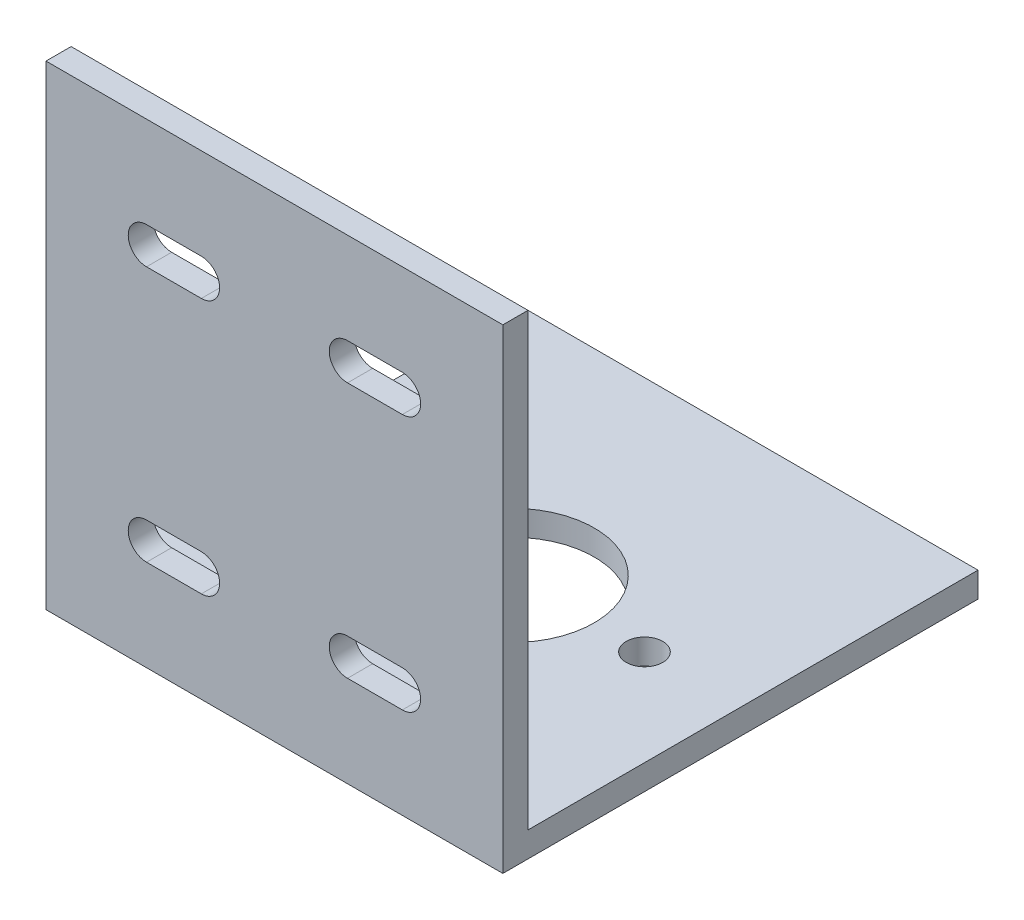
ISO-10303-21;
HEADER;
FILE_DESCRIPTION(('STEP AP214'),'2;1');
FILE_NAME('part.step','',(''),(''),'','','');
FILE_SCHEMA(('AUTOMOTIVE_DESIGN { 1 0 10303 214 1 1 1 1 }'));
ENDSEC;
DATA;
#1=APPLICATION_CONTEXT('core data for automotive mechanical design processes');
#2=APPLICATION_PROTOCOL_DEFINITION('international standard','automotive_design',2000,#1);
#3=PRODUCT_CONTEXT('',#1,'mechanical');
#4=PRODUCT('Part','Part','',(#3));
#5=PRODUCT_RELATED_PRODUCT_CATEGORY('part','',(#4));
#6=PRODUCT_DEFINITION_FORMATION('','',#4);
#7=PRODUCT_DEFINITION_CONTEXT('part definition',#1,'design');
#8=PRODUCT_DEFINITION('design','',#6,#7);
#9=PRODUCT_DEFINITION_SHAPE('','',#8);
#10=(LENGTH_UNIT() NAMED_UNIT(*) SI_UNIT(.MILLI.,.METRE.));
#11=(NAMED_UNIT(*) PLANE_ANGLE_UNIT() SI_UNIT($,.RADIAN.));
#12=(NAMED_UNIT(*) SI_UNIT($,.STERADIAN.) SOLID_ANGLE_UNIT());
#13=UNCERTAINTY_MEASURE_WITH_UNIT(LENGTH_MEASURE(1.E-05),#10,'distance_accuracy_value','');
#14=(GEOMETRIC_REPRESENTATION_CONTEXT(3) GLOBAL_UNCERTAINTY_ASSIGNED_CONTEXT((#13)) GLOBAL_UNIT_ASSIGNED_CONTEXT((#10,
#11,#12)) REPRESENTATION_CONTEXT('',''));
#15=CARTESIAN_POINT('',(0.,0.,0.));
#16=DIRECTION('',(0.,0.,1.));
#17=DIRECTION('',(1.,0.,0.));
#18=AXIS2_PLACEMENT_3D('',#15,#16,#17);
#19=CARTESIAN_POINT('',(0.,2.75,0.));
#20=DIRECTION('',(0.,-1.,0.));
#21=DIRECTION('',(0.,0.,-1.));
#22=AXIS2_PLACEMENT_3D('',#19,#20,#21);
#23=PLANE('',#22);
#24=CARTESIAN_POINT('',(14.5,2.75,0.));
#25=DIRECTION('',(0.,1.,0.));
#26=DIRECTION('',(0.,0.,1.));
#27=AXIS2_PLACEMENT_3D('',#24,#25,#26);
#28=CIRCLE('',#27,2.);
#29=CARTESIAN_POINT('',(14.5,2.75,2.));
#30=VERTEX_POINT('',#29);
#31=EDGE_CURVE('E292',#30,#30,#28,.T.);
#32=ORIENTED_EDGE('',*,*,#31,.F.);
#33=EDGE_LOOP('',(#32));
#34=FACE_BOUND('',#33,.T.);
#35=CARTESIAN_POINT('',(-14.5,2.75,0.));
#36=DIRECTION('',(0.,1.,0.));
#37=DIRECTION('',(0.,0.,1.));
#38=AXIS2_PLACEMENT_3D('',#35,#36,#37);
#39=CIRCLE('',#38,2.);
#40=CARTESIAN_POINT('',(-14.5,2.75,2.));
#41=VERTEX_POINT('',#40);
#42=EDGE_CURVE('E298',#41,#41,#39,.T.);
#43=ORIENTED_EDGE('',*,*,#42,.F.);
#44=EDGE_LOOP('',(#43));
#45=FACE_BOUND('',#44,.T.);
#46=CARTESIAN_POINT('',(0.,2.75,0.));
#47=DIRECTION('',(0.,1.,0.));
#48=DIRECTION('',(0.,0.,1.));
#49=AXIS2_PLACEMENT_3D('',#46,#47,#48);
#50=CIRCLE('',#49,9.);
#51=CARTESIAN_POINT('',(0.,2.75,9.));
#52=VERTEX_POINT('',#51);
#53=EDGE_CURVE('E304',#52,#52,#50,.T.);
#54=ORIENTED_EDGE('',*,*,#53,.F.);
#55=EDGE_LOOP('',(#54));
#56=FACE_BOUND('',#55,.T.);
#57=DIRECTION('',(-1.,0.,0.));
#58=VECTOR('',#57,1.);
#59=CARTESIAN_POINT('',(0.,2.75,23.25));
#60=LINE('',#59,#58);
#61=CARTESIAN_POINT('',(25.,2.75,23.25));
#62=VERTEX_POINT('',#61);
#63=CARTESIAN_POINT('',(-25.,2.75000000000002,23.25));
#64=VERTEX_POINT('',#63);
#65=EDGE_CURVE('E288',#62,#64,#60,.T.);
#66=ORIENTED_EDGE('',*,*,#65,.F.);
#67=DIRECTION('',(0.,0.,-1.));
#68=VECTOR('',#67,1.);
#69=CARTESIAN_POINT('',(25.,2.75,26.));
#70=LINE('',#69,#68);
#71=CARTESIAN_POINT('',(25.,2.75,-26.));
#72=VERTEX_POINT('',#71);
#73=EDGE_CURVE('E312',#62,#72,#70,.T.);
#74=ORIENTED_EDGE('',*,*,#73,.T.);
#75=DIRECTION('',(-1.,0.,0.));
#76=VECTOR('',#75,1.);
#77=CARTESIAN_POINT('',(-25.,2.75,-26.));
#78=LINE('',#77,#76);
#79=CARTESIAN_POINT('',(-25.,2.75,-26.));
#80=VERTEX_POINT('',#79);
#81=EDGE_CURVE('E315',#72,#80,#78,.T.);
#82=ORIENTED_EDGE('',*,*,#81,.T.);
#83=DIRECTION('',(0.,0.,1.));
#84=VECTOR('',#83,1.);
#85=CARTESIAN_POINT('',(-25.,2.75,26.));
#86=LINE('',#85,#84);
#87=EDGE_CURVE('E310',#80,#64,#86,.T.);
#88=ORIENTED_EDGE('',*,*,#87,.T.);
#89=EDGE_LOOP('',(#66,#74,#82,#88));
#90=FACE_BOUND('',#89,.T.);
#91=ADVANCED_FACE('F32',(#34,#45,#56,#90),#23,.F.);
#92=CARTESIAN_POINT('',(0.,0.,0.));
#93=DIRECTION('',(0.,-1.,0.));
#94=DIRECTION('',(0.,0.,-1.));
#95=AXIS2_PLACEMENT_3D('',#92,#93,#94);
#96=PLANE('',#95);
#97=DIRECTION('',(1.,0.,0.));
#98=VECTOR('',#97,1.);
#99=CARTESIAN_POINT('',(-25.,0.,26.));
#100=LINE('',#99,#98);
#101=CARTESIAN_POINT('',(-25.,0.,26.));
#102=VERTEX_POINT('',#101);
#103=CARTESIAN_POINT('',(25.,0.,26.));
#104=VERTEX_POINT('',#103);
#105=EDGE_CURVE('E319',#102,#104,#100,.T.);
#106=ORIENTED_EDGE('',*,*,#105,.F.);
#107=DIRECTION('',(0.,0.,1.));
#108=VECTOR('',#107,1.);
#109=CARTESIAN_POINT('',(-25.,0.,26.));
#110=LINE('',#109,#108);
#111=CARTESIAN_POINT('',(-25.,0.,-26.));
#112=VERTEX_POINT('',#111);
#113=EDGE_CURVE('E307',#112,#102,#110,.T.);
#114=ORIENTED_EDGE('',*,*,#113,.F.);
#115=DIRECTION('',(-1.,0.,0.));
#116=VECTOR('',#115,1.);
#117=CARTESIAN_POINT('',(-25.,0.,-26.));
#118=LINE('',#117,#116);
#119=CARTESIAN_POINT('',(25.,0.,-26.));
#120=VERTEX_POINT('',#119);
#121=EDGE_CURVE('E313',#120,#112,#118,.T.);
#122=ORIENTED_EDGE('',*,*,#121,.F.);
#123=DIRECTION('',(0.,0.,-1.));
#124=VECTOR('',#123,1.);
#125=CARTESIAN_POINT('',(25.,0.,26.));
#126=LINE('',#125,#124);
#127=EDGE_CURVE('E321',#104,#120,#126,.T.);
#128=ORIENTED_EDGE('',*,*,#127,.F.);
#129=EDGE_LOOP('',(#106,#114,#122,#128));
#130=FACE_BOUND('',#129,.T.);
#131=CARTESIAN_POINT('',(-14.5,0.,0.));
#132=DIRECTION('',(0.,1.,0.));
#133=DIRECTION('',(0.,0.,1.));
#134=AXIS2_PLACEMENT_3D('',#131,#132,#133);
#135=CIRCLE('',#134,2.);
#136=CARTESIAN_POINT('',(-14.5,0.,2.));
#137=VERTEX_POINT('',#136);
#138=EDGE_CURVE('E295',#137,#137,#135,.T.);
#139=ORIENTED_EDGE('',*,*,#138,.T.);
#140=EDGE_LOOP('',(#139));
#141=FACE_BOUND('',#140,.T.);
#142=CARTESIAN_POINT('',(0.,0.,0.));
#143=DIRECTION('',(0.,1.,0.));
#144=DIRECTION('',(0.,0.,1.));
#145=AXIS2_PLACEMENT_3D('',#142,#143,#144);
#146=CIRCLE('',#145,9.);
#147=CARTESIAN_POINT('',(0.,0.,9.));
#148=VERTEX_POINT('',#147);
#149=EDGE_CURVE('E301',#148,#148,#146,.T.);
#150=ORIENTED_EDGE('',*,*,#149,.T.);
#151=EDGE_LOOP('',(#150));
#152=FACE_BOUND('',#151,.T.);
#153=CARTESIAN_POINT('',(14.5,0.,0.));
#154=DIRECTION('',(0.,1.,0.));
#155=DIRECTION('',(0.,0.,1.));
#156=AXIS2_PLACEMENT_3D('',#153,#154,#155);
#157=CIRCLE('',#156,2.);
#158=CARTESIAN_POINT('',(14.5,0.,2.));
#159=VERTEX_POINT('',#158);
#160=EDGE_CURVE('E291',#159,#159,#157,.T.);
#161=ORIENTED_EDGE('',*,*,#160,.T.);
#162=EDGE_LOOP('',(#161));
#163=FACE_BOUND('',#162,.T.);
#164=ADVANCED_FACE('F395',(#130,#141,#152,#163),#96,.T.);
#165=CARTESIAN_POINT('',(-25.,2.75,26.));
#166=DIRECTION('',(1.,0.,0.));
#167=DIRECTION('',(0.,0.,-1.));
#168=AXIS2_PLACEMENT_3D('',#165,#166,#167);
#169=PLANE('',#168);
#170=DIRECTION('',(0.,-1.,0.));
#171=VECTOR('',#170,1.);
#172=CARTESIAN_POINT('',(-25.,2.75,26.));
#173=LINE('',#172,#171);
#174=CARTESIAN_POINT('',(-25.,52.,26.));
#175=VERTEX_POINT('',#174);
#176=EDGE_CURVE('E332',#175,#102,#173,.T.);
#177=ORIENTED_EDGE('',*,*,#176,.F.);
#178=DIRECTION('',(0.,0.,1.));
#179=VECTOR('',#178,1.);
#180=CARTESIAN_POINT('',(-25.,52.,26.));
#181=LINE('',#180,#179);
#182=CARTESIAN_POINT('',(-25.,52.,23.25));
#183=VERTEX_POINT('',#182);
#184=EDGE_CURVE('E266',#183,#175,#181,.T.);
#185=ORIENTED_EDGE('',*,*,#184,.F.);
#186=DIRECTION('',(0.,-1.,0.));
#187=VECTOR('',#186,1.);
#188=CARTESIAN_POINT('',(-25.,52.,23.25));
#189=LINE('',#188,#187);
#190=EDGE_CURVE('E282',#183,#64,#189,.T.);
#191=ORIENTED_EDGE('',*,*,#190,.T.);
#192=ORIENTED_EDGE('',*,*,#87,.F.);
#193=DIRECTION('',(0.,-1.,0.));
#194=VECTOR('',#193,1.);
#195=CARTESIAN_POINT('',(-25.,2.75,-26.));
#196=LINE('',#195,#194);
#197=EDGE_CURVE('E317',#80,#112,#196,.T.);
#198=ORIENTED_EDGE('',*,*,#197,.T.);
#199=ORIENTED_EDGE('',*,*,#113,.T.);
#200=EDGE_LOOP('',(#177,#185,#191,#192,#198,#199));
#201=FACE_BOUND('',#200,.T.);
#202=ADVANCED_FACE('F34',(#201),#169,.F.);
#203=CARTESIAN_POINT('',(-25.,2.75,26.));
#204=DIRECTION('',(0.,0.,-1.));
#205=DIRECTION('',(-1.,0.,0.));
#206=AXIS2_PLACEMENT_3D('',#203,#204,#205);
#207=PLANE('',#206);
#208=DIRECTION('',(1.,0.,0.));
#209=VECTOR('',#208,1.);
#210=CARTESIAN_POINT('',(8.,10.,26.));
#211=LINE('',#210,#209);
#212=CARTESIAN_POINT('',(8.,10.,26.));
#213=VERTEX_POINT('',#212);
#214=CARTESIAN_POINT('',(14.,10.,26.));
#215=VERTEX_POINT('',#214);
#216=EDGE_CURVE('E198',#213,#215,#211,.T.);
#217=ORIENTED_EDGE('',*,*,#216,.F.);
#218=CARTESIAN_POINT('',(8.,12.,26.));
#219=DIRECTION('',(0.,0.,1.));
#220=DIRECTION('',(1.,0.,0.));
#221=AXIS2_PLACEMENT_3D('',#218,#219,#220);
#222=CIRCLE('',#221,2.);
#223=CARTESIAN_POINT('',(8.,14.,26.));
#224=VERTEX_POINT('',#223);
#225=EDGE_CURVE('E47',#224,#213,#222,.T.);
#226=ORIENTED_EDGE('',*,*,#225,.F.);
#227=DIRECTION('',(-1.,0.,0.));
#228=VECTOR('',#227,1.);
#229=CARTESIAN_POINT('',(8.,14.,26.));
#230=LINE('',#229,#228);
#231=CARTESIAN_POINT('',(14.,14.,26.));
#232=VERTEX_POINT('',#231);
#233=EDGE_CURVE('E205',#232,#224,#230,.T.);
#234=ORIENTED_EDGE('',*,*,#233,.F.);
#235=CARTESIAN_POINT('',(14.,12.,26.));
#236=DIRECTION('',(0.,0.,1.));
#237=DIRECTION('',(1.,0.,0.));
#238=AXIS2_PLACEMENT_3D('',#235,#236,#237);
#239=CIRCLE('',#238,2.);
#240=EDGE_CURVE('E188',#215,#232,#239,.T.);
#241=ORIENTED_EDGE('',*,*,#240,.F.);
#242=EDGE_LOOP('',(#217,#226,#234,#241));
#243=FACE_BOUND('',#242,.T.);
#244=DIRECTION('',(1.,0.,0.));
#245=VECTOR('',#244,1.);
#246=CARTESIAN_POINT('',(7.9999999999999,38.,26.));
#247=LINE('',#246,#245);
#248=CARTESIAN_POINT('',(7.9999999999999,38.,26.));
#249=VERTEX_POINT('',#248);
#250=CARTESIAN_POINT('',(13.9999999999999,38.,26.));
#251=VERTEX_POINT('',#250);
#252=EDGE_CURVE('E216',#249,#251,#247,.T.);
#253=ORIENTED_EDGE('',*,*,#252,.F.);
#254=CARTESIAN_POINT('',(7.9999999999999,40.,26.));
#255=DIRECTION('',(0.,0.,1.));
#256=DIRECTION('',(1.,0.,0.));
#257=AXIS2_PLACEMENT_3D('',#254,#255,#256);
#258=CIRCLE('',#257,2.);
#259=CARTESIAN_POINT('',(7.9999999999999,42.,26.));
#260=VERTEX_POINT('',#259);
#261=EDGE_CURVE('E55',#260,#249,#258,.T.);
#262=ORIENTED_EDGE('',*,*,#261,.F.);
#263=DIRECTION('',(-1.,0.,0.));
#264=VECTOR('',#263,1.);
#265=CARTESIAN_POINT('',(7.9999999999999,42.,26.));
#266=LINE('',#265,#264);
#267=CARTESIAN_POINT('',(13.9999999999999,42.,26.));
#268=VERTEX_POINT('',#267);
#269=EDGE_CURVE('E223',#268,#260,#266,.T.);
#270=ORIENTED_EDGE('',*,*,#269,.F.);
#271=CARTESIAN_POINT('',(13.9999999999999,40.,26.));
#272=DIRECTION('',(0.,0.,1.));
#273=DIRECTION('',(1.,0.,0.));
#274=AXIS2_PLACEMENT_3D('',#271,#272,#273);
#275=CIRCLE('',#274,2.);
#276=EDGE_CURVE('E220',#251,#268,#275,.T.);
#277=ORIENTED_EDGE('',*,*,#276,.F.);
#278=EDGE_LOOP('',(#253,#262,#270,#277));
#279=FACE_BOUND('',#278,.T.);
#280=DIRECTION('',(1.,0.,0.));
#281=VECTOR('',#280,1.);
#282=CARTESIAN_POINT('',(-14.0000000000001,38.,26.));
#283=LINE('',#282,#281);
#284=CARTESIAN_POINT('',(-14.0000000000001,38.,26.));
#285=VERTEX_POINT('',#284);
#286=CARTESIAN_POINT('',(-8.0000000000001,38.,26.));
#287=VERTEX_POINT('',#286);
#288=EDGE_CURVE('E236',#285,#287,#283,.T.);
#289=ORIENTED_EDGE('',*,*,#288,.F.);
#290=CARTESIAN_POINT('',(-14.0000000000001,40.,26.));
#291=DIRECTION('',(0.,0.,1.));
#292=DIRECTION('',(1.,0.,0.));
#293=AXIS2_PLACEMENT_3D('',#290,#291,#292);
#294=CIRCLE('',#293,2.);
#295=CARTESIAN_POINT('',(-14.0000000000001,42.,26.));
#296=VERTEX_POINT('',#295);
#297=EDGE_CURVE('E234',#296,#285,#294,.T.);
#298=ORIENTED_EDGE('',*,*,#297,.F.);
#299=DIRECTION('',(-1.,0.,0.));
#300=VECTOR('',#299,1.);
#301=CARTESIAN_POINT('',(-14.0000000000001,42.,26.));
#302=LINE('',#301,#300);
#303=CARTESIAN_POINT('',(-8.0000000000001,42.,26.));
#304=VERTEX_POINT('',#303);
#305=EDGE_CURVE('E242',#304,#296,#302,.T.);
#306=ORIENTED_EDGE('',*,*,#305,.F.);
#307=CARTESIAN_POINT('',(-8.0000000000001,40.,26.));
#308=DIRECTION('',(0.,0.,1.));
#309=DIRECTION('',(1.,0.,0.));
#310=AXIS2_PLACEMENT_3D('',#307,#308,#309);
#311=CIRCLE('',#310,2.);
#312=EDGE_CURVE('E239',#287,#304,#311,.T.);
#313=ORIENTED_EDGE('',*,*,#312,.F.);
#314=EDGE_LOOP('',(#289,#298,#306,#313));
#315=FACE_BOUND('',#314,.T.);
#316=DIRECTION('',(1.,0.,0.));
#317=VECTOR('',#316,1.);
#318=CARTESIAN_POINT('',(-14.,10.,26.));
#319=LINE('',#318,#317);
#320=CARTESIAN_POINT('',(-14.,10.,26.));
#321=VERTEX_POINT('',#320);
#322=CARTESIAN_POINT('',(-8.,10.,26.));
#323=VERTEX_POINT('',#322);
#324=EDGE_CURVE('E254',#321,#323,#319,.T.);
#325=ORIENTED_EDGE('',*,*,#324,.F.);
#326=CARTESIAN_POINT('',(-14.,12.,26.));
#327=DIRECTION('',(0.,0.,1.));
#328=DIRECTION('',(1.,0.,0.));
#329=AXIS2_PLACEMENT_3D('',#326,#327,#328);
#330=CIRCLE('',#329,2.);
#331=CARTESIAN_POINT('',(-14.,14.,26.));
#332=VERTEX_POINT('',#331);
#333=EDGE_CURVE('E212',#332,#321,#330,.T.);
#334=ORIENTED_EDGE('',*,*,#333,.F.);
#335=DIRECTION('',(-1.,0.,0.));
#336=VECTOR('',#335,1.);
#337=CARTESIAN_POINT('',(-14.,14.,26.));
#338=LINE('',#337,#336);
#339=CARTESIAN_POINT('',(-8.,14.,26.));
#340=VERTEX_POINT('',#339);
#341=EDGE_CURVE('E260',#340,#332,#338,.T.);
#342=ORIENTED_EDGE('',*,*,#341,.F.);
#343=CARTESIAN_POINT('',(-8.,12.,26.));
#344=DIRECTION('',(0.,0.,1.));
#345=DIRECTION('',(1.,0.,0.));
#346=AXIS2_PLACEMENT_3D('',#343,#344,#345);
#347=CIRCLE('',#346,2.);
#348=EDGE_CURVE('E257',#323,#340,#347,.T.);
#349=ORIENTED_EDGE('',*,*,#348,.F.);
#350=EDGE_LOOP('',(#325,#334,#342,#349));
#351=FACE_BOUND('',#350,.T.);
#352=ORIENTED_EDGE('',*,*,#105,.T.);
#353=DIRECTION('',(0.,-1.,0.));
#354=VECTOR('',#353,1.);
#355=CARTESIAN_POINT('',(25.,2.75,26.));
#356=LINE('',#355,#354);
#357=CARTESIAN_POINT('',(25.,52.,26.));
#358=VERTEX_POINT('',#357);
#359=EDGE_CURVE('E329',#358,#104,#356,.T.);
#360=ORIENTED_EDGE('',*,*,#359,.F.);
#361=DIRECTION('',(1.,0.,0.));
#362=VECTOR('',#361,1.);
#363=CARTESIAN_POINT('',(-25.,52.,26.));
#364=LINE('',#363,#362);
#365=EDGE_CURVE('E275',#175,#358,#364,.T.);
#366=ORIENTED_EDGE('',*,*,#365,.F.);
#367=ORIENTED_EDGE('',*,*,#176,.T.);
#368=EDGE_LOOP('',(#352,#360,#366,#367));
#369=FACE_BOUND('',#368,.T.);
#370=ADVANCED_FACE('F202',(#243,#279,#315,#351,#369),#207,.F.);
#371=CARTESIAN_POINT('',(25.,2.75,26.));
#372=DIRECTION('',(-1.,0.,0.));
#373=DIRECTION('',(0.,0.,1.));
#374=AXIS2_PLACEMENT_3D('',#371,#372,#373);
#375=PLANE('',#374);
#376=ORIENTED_EDGE('',*,*,#127,.T.);
#377=DIRECTION('',(0.,-1.,0.));
#378=VECTOR('',#377,1.);
#379=CARTESIAN_POINT('',(25.,2.75,-26.));
#380=LINE('',#379,#378);
#381=EDGE_CURVE('E326',#72,#120,#380,.T.);
#382=ORIENTED_EDGE('',*,*,#381,.F.);
#383=ORIENTED_EDGE('',*,*,#73,.F.);
#384=DIRECTION('',(0.,-1.,0.));
#385=VECTOR('',#384,1.);
#386=CARTESIAN_POINT('',(25.,52.,23.25));
#387=LINE('',#386,#385);
#388=CARTESIAN_POINT('',(25.,52.,23.25));
#389=VERTEX_POINT('',#388);
#390=EDGE_CURVE('E285',#389,#62,#387,.T.);
#391=ORIENTED_EDGE('',*,*,#390,.F.);
#392=DIRECTION('',(0.,0.,-1.));
#393=VECTOR('',#392,1.);
#394=CARTESIAN_POINT('',(25.,52.,26.));
#395=LINE('',#394,#393);
#396=EDGE_CURVE('E278',#358,#389,#395,.T.);
#397=ORIENTED_EDGE('',*,*,#396,.F.);
#398=ORIENTED_EDGE('',*,*,#359,.T.);
#399=EDGE_LOOP('',(#376,#382,#383,#391,#397,#398));
#400=FACE_BOUND('',#399,.T.);
#401=ADVANCED_FACE('F412',(#400),#375,.F.);
#402=CARTESIAN_POINT('',(-25.,2.75,-26.));
#403=DIRECTION('',(0.,0.,1.));
#404=DIRECTION('',(1.,0.,0.));
#405=AXIS2_PLACEMENT_3D('',#402,#403,#404);
#406=PLANE('',#405);
#407=ORIENTED_EDGE('',*,*,#121,.T.);
#408=ORIENTED_EDGE('',*,*,#197,.F.);
#409=ORIENTED_EDGE('',*,*,#81,.F.);
#410=ORIENTED_EDGE('',*,*,#381,.T.);
#411=EDGE_LOOP('',(#407,#408,#409,#410));
#412=FACE_BOUND('',#411,.T.);
#413=ADVANCED_FACE('F409',(#412),#406,.F.);
#414=CARTESIAN_POINT('',(0.,2.75,0.));
#415=DIRECTION('',(0.,-1.,0.));
#416=DIRECTION('',(0.,0.,-1.));
#417=AXIS2_PLACEMENT_3D('',#414,#415,#416);
#418=CYLINDRICAL_SURFACE('',#417,9.);
#419=ORIENTED_EDGE('',*,*,#53,.T.);
#420=EDGE_LOOP('',(#419));
#421=FACE_BOUND('',#420,.T.);
#422=ORIENTED_EDGE('',*,*,#149,.F.);
#423=EDGE_LOOP('',(#422));
#424=FACE_BOUND('',#423,.T.);
#425=ADVANCED_FACE('F406',(#421,#424),#418,.F.);
#426=CARTESIAN_POINT('',(-14.5,2.75,0.));
#427=DIRECTION('',(0.,-1.,0.));
#428=DIRECTION('',(0.,0.,-1.));
#429=AXIS2_PLACEMENT_3D('',#426,#427,#428);
#430=CYLINDRICAL_SURFACE('',#429,2.);
#431=ORIENTED_EDGE('',*,*,#42,.T.);
#432=EDGE_LOOP('',(#431));
#433=FACE_BOUND('',#432,.T.);
#434=ORIENTED_EDGE('',*,*,#138,.F.);
#435=EDGE_LOOP('',(#434));
#436=FACE_BOUND('',#435,.T.);
#437=ADVANCED_FACE('F452',(#433,#436),#430,.F.);
#438=CARTESIAN_POINT('',(14.5,2.75,0.));
#439=DIRECTION('',(0.,-1.,0.));
#440=DIRECTION('',(0.,0.,-1.));
#441=AXIS2_PLACEMENT_3D('',#438,#439,#440);
#442=CYLINDRICAL_SURFACE('',#441,2.);
#443=ORIENTED_EDGE('',*,*,#31,.T.);
#444=EDGE_LOOP('',(#443));
#445=FACE_BOUND('',#444,.T.);
#446=ORIENTED_EDGE('',*,*,#160,.F.);
#447=EDGE_LOOP('',(#446));
#448=FACE_BOUND('',#447,.T.);
#449=ADVANCED_FACE('F450',(#445,#448),#442,.F.);
#450=CARTESIAN_POINT('',(-25.,52.,23.25));
#451=DIRECTION('',(0.,0.,1.));
#452=DIRECTION('',(1.,0.,0.));
#453=AXIS2_PLACEMENT_3D('',#450,#451,#452);
#454=PLANE('',#453);
#455=DIRECTION('',(-1.,0.,0.));
#456=VECTOR('',#455,1.);
#457=CARTESIAN_POINT('',(-25.,14.,23.25));
#458=LINE('',#457,#456);
#459=CARTESIAN_POINT('',(14.,14.,23.25));
#460=VERTEX_POINT('',#459);
#461=CARTESIAN_POINT('',(8.,14.,23.25));
#462=VERTEX_POINT('',#461);
#463=EDGE_CURVE('E40',#460,#462,#458,.T.);
#464=ORIENTED_EDGE('',*,*,#463,.T.);
#465=CARTESIAN_POINT('',(8.,12.,23.25));
#466=DIRECTION('',(0.,0.,1.));
#467=DIRECTION('',(1.,0.,0.));
#468=AXIS2_PLACEMENT_3D('',#465,#466,#467);
#469=CIRCLE('',#468,2.);
#470=CARTESIAN_POINT('',(8.,10.,23.25));
#471=VERTEX_POINT('',#470);
#472=EDGE_CURVE('E11',#462,#471,#469,.T.);
#473=ORIENTED_EDGE('',*,*,#472,.T.);
#474=DIRECTION('',(1.,0.,0.));
#475=VECTOR('',#474,1.);
#476=CARTESIAN_POINT('',(-25.,10.,23.25));
#477=LINE('',#476,#475);
#478=CARTESIAN_POINT('',(14.,10.,23.25));
#479=VERTEX_POINT('',#478);
#480=EDGE_CURVE('E371',#471,#479,#477,.T.);
#481=ORIENTED_EDGE('',*,*,#480,.T.);
#482=CARTESIAN_POINT('',(14.,12.,23.25));
#483=DIRECTION('',(0.,0.,1.));
#484=DIRECTION('',(1.,0.,0.));
#485=AXIS2_PLACEMENT_3D('',#482,#483,#484);
#486=CIRCLE('',#485,2.);
#487=EDGE_CURVE('E191',#479,#460,#486,.T.);
#488=ORIENTED_EDGE('',*,*,#487,.T.);
#489=EDGE_LOOP('',(#464,#473,#481,#488));
#490=FACE_BOUND('',#489,.T.);
#491=DIRECTION('',(-1.,0.,0.));
#492=VECTOR('',#491,1.);
#493=CARTESIAN_POINT('',(-25.,42.,23.25));
#494=LINE('',#493,#492);
#495=CARTESIAN_POINT('',(13.9999999999999,42.,23.25));
#496=VERTEX_POINT('',#495);
#497=CARTESIAN_POINT('',(7.9999999999999,42.,23.25));
#498=VERTEX_POINT('',#497);
#499=EDGE_CURVE('E365',#496,#498,#494,.T.);
#500=ORIENTED_EDGE('',*,*,#499,.T.);
#501=CARTESIAN_POINT('',(7.9999999999999,40.,23.25));
#502=DIRECTION('',(0.,0.,1.));
#503=DIRECTION('',(1.,0.,0.));
#504=AXIS2_PLACEMENT_3D('',#501,#502,#503);
#505=CIRCLE('',#504,2.);
#506=CARTESIAN_POINT('',(7.9999999999999,38.,23.25));
#507=VERTEX_POINT('',#506);
#508=EDGE_CURVE('E368',#498,#507,#505,.T.);
#509=ORIENTED_EDGE('',*,*,#508,.T.);
#510=DIRECTION('',(1.,0.,0.));
#511=VECTOR('',#510,1.);
#512=CARTESIAN_POINT('',(-25.,38.,23.25));
#513=LINE('',#512,#511);
#514=CARTESIAN_POINT('',(13.9999999999999,38.,23.25));
#515=VERTEX_POINT('',#514);
#516=EDGE_CURVE('E359',#507,#515,#513,.T.);
#517=ORIENTED_EDGE('',*,*,#516,.T.);
#518=CARTESIAN_POINT('',(13.9999999999999,40.,23.25));
#519=DIRECTION('',(0.,0.,1.));
#520=DIRECTION('',(1.,0.,0.));
#521=AXIS2_PLACEMENT_3D('',#518,#519,#520);
#522=CIRCLE('',#521,2.);
#523=EDGE_CURVE('E362',#515,#496,#522,.T.);
#524=ORIENTED_EDGE('',*,*,#523,.T.);
#525=EDGE_LOOP('',(#500,#509,#517,#524));
#526=FACE_BOUND('',#525,.T.);
#527=DIRECTION('',(-1.,0.,0.));
#528=VECTOR('',#527,1.);
#529=CARTESIAN_POINT('',(-25.,42.,23.25));
#530=LINE('',#529,#528);
#531=CARTESIAN_POINT('',(-8.0000000000001,42.,23.25));
#532=VERTEX_POINT('',#531);
#533=CARTESIAN_POINT('',(-14.0000000000001,42.,23.25));
#534=VERTEX_POINT('',#533);
#535=EDGE_CURVE('E353',#532,#534,#530,.T.);
#536=ORIENTED_EDGE('',*,*,#535,.T.);
#537=CARTESIAN_POINT('',(-14.0000000000001,40.,23.25));
#538=DIRECTION('',(0.,0.,1.));
#539=DIRECTION('',(1.,0.,0.));
#540=AXIS2_PLACEMENT_3D('',#537,#538,#539);
#541=CIRCLE('',#540,2.);
#542=CARTESIAN_POINT('',(-14.0000000000001,38.,23.25));
#543=VERTEX_POINT('',#542);
#544=EDGE_CURVE('E356',#534,#543,#541,.T.);
#545=ORIENTED_EDGE('',*,*,#544,.T.);
#546=DIRECTION('',(1.,0.,0.));
#547=VECTOR('',#546,1.);
#548=CARTESIAN_POINT('',(-25.,38.,23.25));
#549=LINE('',#548,#547);
#550=CARTESIAN_POINT('',(-8.0000000000001,38.,23.25));
#551=VERTEX_POINT('',#550);
#552=EDGE_CURVE('E347',#543,#551,#549,.T.);
#553=ORIENTED_EDGE('',*,*,#552,.T.);
#554=CARTESIAN_POINT('',(-8.0000000000001,40.,23.25));
#555=DIRECTION('',(0.,0.,1.));
#556=DIRECTION('',(1.,0.,0.));
#557=AXIS2_PLACEMENT_3D('',#554,#555,#556);
#558=CIRCLE('',#557,2.);
#559=EDGE_CURVE('E350',#551,#532,#558,.T.);
#560=ORIENTED_EDGE('',*,*,#559,.T.);
#561=EDGE_LOOP('',(#536,#545,#553,#560));
#562=FACE_BOUND('',#561,.T.);
#563=DIRECTION('',(-1.,0.,0.));
#564=VECTOR('',#563,1.);
#565=CARTESIAN_POINT('',(-25.,14.,23.25));
#566=LINE('',#565,#564);
#567=CARTESIAN_POINT('',(-8.,14.,23.25));
#568=VERTEX_POINT('',#567);
#569=CARTESIAN_POINT('',(-14.,14.,23.25));
#570=VERTEX_POINT('',#569);
#571=EDGE_CURVE('E341',#568,#570,#566,.T.);
#572=ORIENTED_EDGE('',*,*,#571,.T.);
#573=CARTESIAN_POINT('',(-14.,12.,23.25));
#574=DIRECTION('',(0.,0.,1.));
#575=DIRECTION('',(1.,0.,0.));
#576=AXIS2_PLACEMENT_3D('',#573,#574,#575);
#577=CIRCLE('',#576,2.);
#578=CARTESIAN_POINT('',(-14.,10.,23.25));
#579=VERTEX_POINT('',#578);
#580=EDGE_CURVE('E344',#570,#579,#577,.T.);
#581=ORIENTED_EDGE('',*,*,#580,.T.);
#582=DIRECTION('',(1.,0.,0.));
#583=VECTOR('',#582,1.);
#584=CARTESIAN_POINT('',(-25.,10.,23.25));
#585=LINE('',#584,#583);
#586=CARTESIAN_POINT('',(-8.00000000000001,10.,23.25));
#587=VERTEX_POINT('',#586);
#588=EDGE_CURVE('E335',#579,#587,#585,.T.);
#589=ORIENTED_EDGE('',*,*,#588,.T.);
#590=CARTESIAN_POINT('',(-8.,12.,23.25));
#591=DIRECTION('',(0.,0.,1.));
#592=DIRECTION('',(1.,0.,0.));
#593=AXIS2_PLACEMENT_3D('',#590,#591,#592);
#594=CIRCLE('',#593,2.);
#595=EDGE_CURVE('E338',#587,#568,#594,.T.);
#596=ORIENTED_EDGE('',*,*,#595,.T.);
#597=EDGE_LOOP('',(#572,#581,#589,#596));
#598=FACE_BOUND('',#597,.T.);
#599=ORIENTED_EDGE('',*,*,#390,.T.);
#600=ORIENTED_EDGE('',*,*,#65,.T.);
#601=ORIENTED_EDGE('',*,*,#190,.F.);
#602=DIRECTION('',(-1.,0.,0.));
#603=VECTOR('',#602,1.);
#604=CARTESIAN_POINT('',(-25.,52.,23.25));
#605=LINE('',#604,#603);
#606=EDGE_CURVE('E280',#389,#183,#605,.T.);
#607=ORIENTED_EDGE('',*,*,#606,.F.);
#608=EDGE_LOOP('',(#599,#600,#601,#607));
#609=FACE_BOUND('',#608,.T.);
#610=ADVANCED_FACE('F375',(#490,#526,#562,#598,#609),#454,.F.);
#611=CARTESIAN_POINT('',(0.,52.,0.));
#612=DIRECTION('',(0.,-1.,0.));
#613=DIRECTION('',(0.,0.,-1.));
#614=AXIS2_PLACEMENT_3D('',#611,#612,#613);
#615=PLANE('',#614);
#616=ORIENTED_EDGE('',*,*,#184,.T.);
#617=ORIENTED_EDGE('',*,*,#365,.T.);
#618=ORIENTED_EDGE('',*,*,#396,.T.);
#619=ORIENTED_EDGE('',*,*,#606,.T.);
#620=EDGE_LOOP('',(#616,#617,#618,#619));
#621=FACE_BOUND('',#620,.T.);
#622=ADVANCED_FACE('F430',(#621),#615,.F.);
#623=CARTESIAN_POINT('',(-14.,12.,-26.));
#624=DIRECTION('',(0.,0.,1.));
#625=DIRECTION('',(1.,0.,0.));
#626=AXIS2_PLACEMENT_3D('',#623,#624,#625);
#627=CYLINDRICAL_SURFACE('',#626,2.);
#628=DIRECTION('',(0.,0.,1.));
#629=VECTOR('',#628,1.);
#630=CARTESIAN_POINT('',(-14.,14.,-26.));
#631=LINE('',#630,#629);
#632=EDGE_CURVE('E264',#570,#332,#631,.T.);
#633=ORIENTED_EDGE('',*,*,#632,.T.);
#634=ORIENTED_EDGE('',*,*,#333,.T.);
#635=DIRECTION('',(0.,0.,1.));
#636=VECTOR('',#635,1.);
#637=CARTESIAN_POINT('',(-14.,10.,-26.));
#638=LINE('',#637,#636);
#639=EDGE_CURVE('E263',#579,#321,#638,.T.);
#640=ORIENTED_EDGE('',*,*,#639,.F.);
#641=ORIENTED_EDGE('',*,*,#580,.F.);
#642=EDGE_LOOP('',(#633,#634,#640,#641));
#643=FACE_BOUND('',#642,.T.);
#644=ADVANCED_FACE('F464',(#643),#627,.F.);
#645=CARTESIAN_POINT('',(-14.,14.,-26.));
#646=DIRECTION('',(0.,1.,0.));
#647=DIRECTION('',(0.,0.,1.));
#648=AXIS2_PLACEMENT_3D('',#645,#646,#647);
#649=PLANE('',#648);
#650=DIRECTION('',(0.,0.,1.));
#651=VECTOR('',#650,1.);
#652=CARTESIAN_POINT('',(-8.,14.,-26.));
#653=LINE('',#652,#651);
#654=EDGE_CURVE('E267',#568,#340,#653,.T.);
#655=ORIENTED_EDGE('',*,*,#654,.T.);
#656=ORIENTED_EDGE('',*,*,#341,.T.);
#657=ORIENTED_EDGE('',*,*,#632,.F.);
#658=ORIENTED_EDGE('',*,*,#571,.F.);
#659=EDGE_LOOP('',(#655,#656,#657,#658));
#660=FACE_BOUND('',#659,.T.);
#661=ADVANCED_FACE('F467',(#660),#649,.F.);
#662=CARTESIAN_POINT('',(-8.,12.,-26.));
#663=DIRECTION('',(0.,0.,1.));
#664=DIRECTION('',(1.,0.,0.));
#665=AXIS2_PLACEMENT_3D('',#662,#663,#664);
#666=CYLINDRICAL_SURFACE('',#665,2.);
#667=DIRECTION('',(0.,0.,1.));
#668=VECTOR('',#667,1.);
#669=CARTESIAN_POINT('',(-8.,10.,-26.));
#670=LINE('',#669,#668);
#671=EDGE_CURVE('E269',#587,#323,#670,.T.);
#672=ORIENTED_EDGE('',*,*,#671,.T.);
#673=ORIENTED_EDGE('',*,*,#348,.T.);
#674=ORIENTED_EDGE('',*,*,#654,.F.);
#675=ORIENTED_EDGE('',*,*,#595,.F.);
#676=EDGE_LOOP('',(#672,#673,#674,#675));
#677=FACE_BOUND('',#676,.T.);
#678=ADVANCED_FACE('F473',(#677),#666,.F.);
#679=CARTESIAN_POINT('',(-14.,10.,-26.));
#680=DIRECTION('',(0.,-1.,0.));
#681=DIRECTION('',(0.,0.,-1.));
#682=AXIS2_PLACEMENT_3D('',#679,#680,#681);
#683=PLANE('',#682);
#684=ORIENTED_EDGE('',*,*,#639,.T.);
#685=ORIENTED_EDGE('',*,*,#324,.T.);
#686=ORIENTED_EDGE('',*,*,#671,.F.);
#687=ORIENTED_EDGE('',*,*,#588,.F.);
#688=EDGE_LOOP('',(#684,#685,#686,#687));
#689=FACE_BOUND('',#688,.T.);
#690=ADVANCED_FACE('F469',(#689),#683,.F.);
#691=CARTESIAN_POINT('',(-14.0000000000001,40.,-26.));
#692=DIRECTION('',(0.,0.,1.));
#693=DIRECTION('',(1.,0.,0.));
#694=AXIS2_PLACEMENT_3D('',#691,#692,#693);
#695=CYLINDRICAL_SURFACE('',#694,2.);
#696=DIRECTION('',(0.,0.,1.));
#697=VECTOR('',#696,1.);
#698=CARTESIAN_POINT('',(-14.0000000000001,42.,-26.));
#699=LINE('',#698,#697);
#700=EDGE_CURVE('E217',#534,#296,#699,.T.);
#701=ORIENTED_EDGE('',*,*,#700,.T.);
#702=ORIENTED_EDGE('',*,*,#297,.T.);
#703=DIRECTION('',(0.,0.,1.));
#704=VECTOR('',#703,1.);
#705=CARTESIAN_POINT('',(-14.0000000000001,38.,-26.));
#706=LINE('',#705,#704);
#707=EDGE_CURVE('E245',#543,#285,#706,.T.);
#708=ORIENTED_EDGE('',*,*,#707,.F.);
#709=ORIENTED_EDGE('',*,*,#544,.F.);
#710=EDGE_LOOP('',(#701,#702,#708,#709));
#711=FACE_BOUND('',#710,.T.);
#712=ADVANCED_FACE('F472',(#711),#695,.F.);
#713=CARTESIAN_POINT('',(-14.0000000000001,42.,-26.));
#714=DIRECTION('',(0.,1.,0.));
#715=DIRECTION('',(0.,0.,1.));
#716=AXIS2_PLACEMENT_3D('',#713,#714,#715);
#717=PLANE('',#716);
#718=DIRECTION('',(0.,0.,1.));
#719=VECTOR('',#718,1.);
#720=CARTESIAN_POINT('',(-8.0000000000001,42.,-26.));
#721=LINE('',#720,#719);
#722=EDGE_CURVE('E247',#532,#304,#721,.T.);
#723=ORIENTED_EDGE('',*,*,#722,.T.);
#724=ORIENTED_EDGE('',*,*,#305,.T.);
#725=ORIENTED_EDGE('',*,*,#700,.F.);
#726=ORIENTED_EDGE('',*,*,#535,.F.);
#727=EDGE_LOOP('',(#723,#724,#725,#726));
#728=FACE_BOUND('',#727,.T.);
#729=ADVANCED_FACE('F483',(#728),#717,.F.);
#730=CARTESIAN_POINT('',(-8.0000000000001,40.,-26.));
#731=DIRECTION('',(0.,0.,1.));
#732=DIRECTION('',(1.,0.,0.));
#733=AXIS2_PLACEMENT_3D('',#730,#731,#732);
#734=CYLINDRICAL_SURFACE('',#733,2.);
#735=DIRECTION('',(0.,0.,1.));
#736=VECTOR('',#735,1.);
#737=CARTESIAN_POINT('',(-8.0000000000001,38.,-26.));
#738=LINE('',#737,#736);
#739=EDGE_CURVE('E249',#551,#287,#738,.T.);
#740=ORIENTED_EDGE('',*,*,#739,.T.);
#741=ORIENTED_EDGE('',*,*,#312,.T.);
#742=ORIENTED_EDGE('',*,*,#722,.F.);
#743=ORIENTED_EDGE('',*,*,#559,.F.);
#744=EDGE_LOOP('',(#740,#741,#742,#743));
#745=FACE_BOUND('',#744,.T.);
#746=ADVANCED_FACE('F489',(#745),#734,.F.);
#747=CARTESIAN_POINT('',(-14.0000000000001,38.,-26.));
#748=DIRECTION('',(0.,-1.,0.));
#749=DIRECTION('',(0.,0.,-1.));
#750=AXIS2_PLACEMENT_3D('',#747,#748,#749);
#751=PLANE('',#750);
#752=ORIENTED_EDGE('',*,*,#707,.T.);
#753=ORIENTED_EDGE('',*,*,#288,.T.);
#754=ORIENTED_EDGE('',*,*,#739,.F.);
#755=ORIENTED_EDGE('',*,*,#552,.F.);
#756=EDGE_LOOP('',(#752,#753,#754,#755));
#757=FACE_BOUND('',#756,.T.);
#758=ADVANCED_FACE('F485',(#757),#751,.F.);
#759=CARTESIAN_POINT('',(7.9999999999999,40.,-26.));
#760=DIRECTION('',(0.,0.,1.));
#761=DIRECTION('',(1.,0.,0.));
#762=AXIS2_PLACEMENT_3D('',#759,#760,#761);
#763=CYLINDRICAL_SURFACE('',#762,2.);
#764=DIRECTION('',(0.,0.,1.));
#765=VECTOR('',#764,1.);
#766=CARTESIAN_POINT('',(7.9999999999999,42.,-26.));
#767=LINE('',#766,#765);
#768=EDGE_CURVE('E227',#498,#260,#767,.T.);
#769=ORIENTED_EDGE('',*,*,#768,.T.);
#770=ORIENTED_EDGE('',*,*,#261,.T.);
#771=DIRECTION('',(0.,0.,1.));
#772=VECTOR('',#771,1.);
#773=CARTESIAN_POINT('',(7.9999999999999,38.,-26.));
#774=LINE('',#773,#772);
#775=EDGE_CURVE('E226',#507,#249,#774,.T.);
#776=ORIENTED_EDGE('',*,*,#775,.F.);
#777=ORIENTED_EDGE('',*,*,#508,.F.);
#778=EDGE_LOOP('',(#769,#770,#776,#777));
#779=FACE_BOUND('',#778,.T.);
#780=ADVANCED_FACE('F488',(#779),#763,.F.);
#781=CARTESIAN_POINT('',(7.9999999999999,42.,-26.));
#782=DIRECTION('',(0.,1.,0.));
#783=DIRECTION('',(0.,0.,1.));
#784=AXIS2_PLACEMENT_3D('',#781,#782,#783);
#785=PLANE('',#784);
#786=DIRECTION('',(0.,0.,1.));
#787=VECTOR('',#786,1.);
#788=CARTESIAN_POINT('',(13.9999999999999,42.,-26.));
#789=LINE('',#788,#787);
#790=EDGE_CURVE('E229',#496,#268,#789,.T.);
#791=ORIENTED_EDGE('',*,*,#790,.T.);
#792=ORIENTED_EDGE('',*,*,#269,.T.);
#793=ORIENTED_EDGE('',*,*,#768,.F.);
#794=ORIENTED_EDGE('',*,*,#499,.F.);
#795=EDGE_LOOP('',(#791,#792,#793,#794));
#796=FACE_BOUND('',#795,.T.);
#797=ADVANCED_FACE('F498',(#796),#785,.F.);
#798=CARTESIAN_POINT('',(13.9999999999999,40.,-26.));
#799=DIRECTION('',(0.,0.,1.));
#800=DIRECTION('',(1.,0.,0.));
#801=AXIS2_PLACEMENT_3D('',#798,#799,#800);
#802=CYLINDRICAL_SURFACE('',#801,2.);
#803=DIRECTION('',(0.,0.,1.));
#804=VECTOR('',#803,1.);
#805=CARTESIAN_POINT('',(13.9999999999999,38.,-26.));
#806=LINE('',#805,#804);
#807=EDGE_CURVE('E231',#515,#251,#806,.T.);
#808=ORIENTED_EDGE('',*,*,#807,.T.);
#809=ORIENTED_EDGE('',*,*,#276,.T.);
#810=ORIENTED_EDGE('',*,*,#790,.F.);
#811=ORIENTED_EDGE('',*,*,#523,.F.);
#812=EDGE_LOOP('',(#808,#809,#810,#811));
#813=FACE_BOUND('',#812,.T.);
#814=ADVANCED_FACE('F389',(#813),#802,.F.);
#815=CARTESIAN_POINT('',(7.9999999999999,38.,-26.));
#816=DIRECTION('',(0.,-1.,0.));
#817=DIRECTION('',(0.,0.,-1.));
#818=AXIS2_PLACEMENT_3D('',#815,#816,#817);
#819=PLANE('',#818);
#820=ORIENTED_EDGE('',*,*,#775,.T.);
#821=ORIENTED_EDGE('',*,*,#252,.T.);
#822=ORIENTED_EDGE('',*,*,#807,.F.);
#823=ORIENTED_EDGE('',*,*,#516,.F.);
#824=EDGE_LOOP('',(#820,#821,#822,#823));
#825=FACE_BOUND('',#824,.T.);
#826=ADVANCED_FACE('F382',(#825),#819,.F.);
#827=CARTESIAN_POINT('',(8.,12.,-26.));
#828=DIRECTION('',(0.,0.,1.));
#829=DIRECTION('',(1.,0.,0.));
#830=AXIS2_PLACEMENT_3D('',#827,#828,#829);
#831=CYLINDRICAL_SURFACE('',#830,2.);
#832=DIRECTION('',(0.,0.,1.));
#833=VECTOR('',#832,1.);
#834=CARTESIAN_POINT('',(8.,14.,-26.));
#835=LINE('',#834,#833);
#836=EDGE_CURVE('E210',#462,#224,#835,.T.);
#837=ORIENTED_EDGE('',*,*,#836,.T.);
#838=ORIENTED_EDGE('',*,*,#225,.T.);
#839=DIRECTION('',(0.,0.,1.));
#840=VECTOR('',#839,1.);
#841=CARTESIAN_POINT('',(8.,10.,-26.));
#842=LINE('',#841,#840);
#843=EDGE_CURVE('E195',#471,#213,#842,.T.);
#844=ORIENTED_EDGE('',*,*,#843,.F.);
#845=ORIENTED_EDGE('',*,*,#472,.F.);
#846=EDGE_LOOP('',(#837,#838,#844,#845));
#847=FACE_BOUND('',#846,.T.);
#848=ADVANCED_FACE('F380',(#847),#831,.F.);
#849=CARTESIAN_POINT('',(8.,14.,-26.));
#850=DIRECTION('',(0.,1.,0.));
#851=DIRECTION('',(0.,0.,1.));
#852=AXIS2_PLACEMENT_3D('',#849,#850,#851);
#853=PLANE('',#852);
#854=DIRECTION('',(0.,0.,1.));
#855=VECTOR('',#854,1.);
#856=CARTESIAN_POINT('',(14.,14.,-26.));
#857=LINE('',#856,#855);
#858=EDGE_CURVE('E194',#460,#232,#857,.T.);
#859=ORIENTED_EDGE('',*,*,#858,.T.);
#860=ORIENTED_EDGE('',*,*,#233,.T.);
#861=ORIENTED_EDGE('',*,*,#836,.F.);
#862=ORIENTED_EDGE('',*,*,#463,.F.);
#863=EDGE_LOOP('',(#859,#860,#861,#862));
#864=FACE_BOUND('',#863,.T.);
#865=ADVANCED_FACE('F379',(#864),#853,.F.);
#866=CARTESIAN_POINT('',(14.,12.,-26.));
#867=DIRECTION('',(0.,0.,1.));
#868=DIRECTION('',(1.,0.,0.));
#869=AXIS2_PLACEMENT_3D('',#866,#867,#868);
#870=CYLINDRICAL_SURFACE('',#869,2.);
#871=DIRECTION('',(0.,0.,1.));
#872=VECTOR('',#871,1.);
#873=CARTESIAN_POINT('',(14.,10.,-26.));
#874=LINE('',#873,#872);
#875=EDGE_CURVE('E183',#479,#215,#874,.T.);
#876=ORIENTED_EDGE('',*,*,#875,.T.);
#877=ORIENTED_EDGE('',*,*,#240,.T.);
#878=ORIENTED_EDGE('',*,*,#858,.F.);
#879=ORIENTED_EDGE('',*,*,#487,.F.);
#880=EDGE_LOOP('',(#876,#877,#878,#879));
#881=FACE_BOUND('',#880,.T.);
#882=ADVANCED_FACE('F185',(#881),#870,.F.);
#883=CARTESIAN_POINT('',(8.,10.,-26.));
#884=DIRECTION('',(0.,-1.,0.));
#885=DIRECTION('',(0.,0.,-1.));
#886=AXIS2_PLACEMENT_3D('',#883,#884,#885);
#887=PLANE('',#886);
#888=ORIENTED_EDGE('',*,*,#843,.T.);
#889=ORIENTED_EDGE('',*,*,#216,.T.);
#890=ORIENTED_EDGE('',*,*,#875,.F.);
#891=ORIENTED_EDGE('',*,*,#480,.F.);
#892=EDGE_LOOP('',(#888,#889,#890,#891));
#893=FACE_BOUND('',#892,.T.);
#894=ADVANCED_FACE('F199',(#893),#887,.F.);
#895=CLOSED_SHELL('',(#91,#164,#202,#370,#401,#413,#425,#437,#449,#610,#622,#644,#661,#678,#690,
#712,#729,#746,#758,#780,#797,#814,#826,#848,#865,#882,#894));
#896=MANIFOLD_SOLID_BREP('B2',#895);
#897=ADVANCED_BREP_SHAPE_REPRESENTATION('',(#18,#896),#14);
#898=SHAPE_DEFINITION_REPRESENTATION(#9,#897);
ENDSEC;
END-ISO-10303-21;
